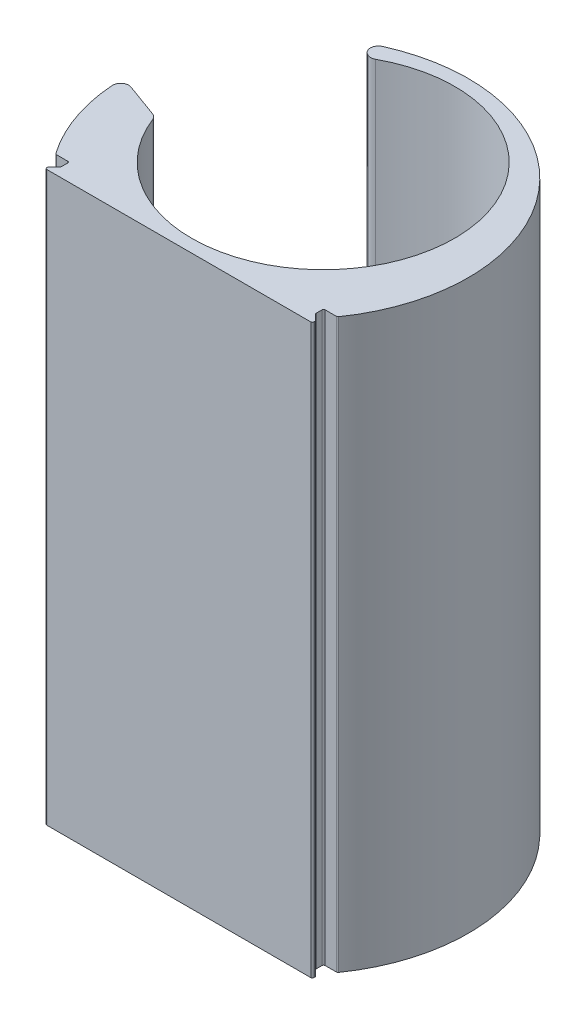
ISO-10303-21;
HEADER;
FILE_DESCRIPTION(('STEP AP214'),'2;1');
FILE_NAME('part.step','',(''),(''),'','','');
FILE_SCHEMA(('AUTOMOTIVE_DESIGN { 1 0 10303 214 1 1 1 1 }'));
ENDSEC;
DATA;
#1=APPLICATION_CONTEXT('core data for automotive mechanical design processes');
#2=APPLICATION_PROTOCOL_DEFINITION('international standard','automotive_design',2000,#1);
#3=PRODUCT_CONTEXT('',#1,'mechanical');
#4=PRODUCT('Part','Part','',(#3));
#5=PRODUCT_RELATED_PRODUCT_CATEGORY('part','',(#4));
#6=PRODUCT_DEFINITION_FORMATION('','',#4);
#7=PRODUCT_DEFINITION_CONTEXT('part definition',#1,'design');
#8=PRODUCT_DEFINITION('design','',#6,#7);
#9=PRODUCT_DEFINITION_SHAPE('','',#8);
#10=(LENGTH_UNIT() NAMED_UNIT(*) SI_UNIT(.MILLI.,.METRE.));
#11=(NAMED_UNIT(*) PLANE_ANGLE_UNIT() SI_UNIT($,.RADIAN.));
#12=(NAMED_UNIT(*) SI_UNIT($,.STERADIAN.) SOLID_ANGLE_UNIT());
#13=UNCERTAINTY_MEASURE_WITH_UNIT(LENGTH_MEASURE(1.E-05),#10,'distance_accuracy_value','');
#14=(GEOMETRIC_REPRESENTATION_CONTEXT(3) GLOBAL_UNCERTAINTY_ASSIGNED_CONTEXT((#13)) GLOBAL_UNIT_ASSIGNED_CONTEXT((#10,
#11,#12)) REPRESENTATION_CONTEXT('',''));
#15=CARTESIAN_POINT('',(0.,0.,0.));
#16=DIRECTION('',(0.,0.,1.));
#17=DIRECTION('',(1.,0.,0.));
#18=AXIS2_PLACEMENT_3D('',#15,#16,#17);
#19=CARTESIAN_POINT('',(-35.9484338432653,70.,15.2835908548455));
#20=DIRECTION('',(0.,-1.,0.));
#21=DIRECTION('',(0.,0.,-1.));
#22=AXIS2_PLACEMENT_3D('',#19,#20,#21);
#23=PLANE('',#22);
#24=DIRECTION('',(1.,0.,0.));
#25=VECTOR('',#24,1.);
#26=CARTESIAN_POINT('',(-18.3863018089094,70.,27.6860711877405));
#27=LINE('',#26,#25);
#28=CARTESIAN_POINT('',(-19.8984338432654,70.,27.6860711877405));
#29=VERTEX_POINT('',#28);
#30=CARTESIAN_POINT('',(-18.490213036857,70.,27.6860711877405));
#31=VERTEX_POINT('',#30);
#32=EDGE_CURVE('E417',#29,#31,#27,.T.);
#33=ORIENTED_EDGE('',*,*,#32,.T.);
#34=CARTESIAN_POINT('',(-18.490213036857,70.,27.4860711877405));
#35=DIRECTION('',(0.,-1.,0.));
#36=DIRECTION('',(0.,0.,-1.));
#37=AXIS2_PLACEMENT_3D('',#34,#35,#36);
#38=CIRCLE('',#37,0.2);
#39=CARTESIAN_POINT('',(-18.3262860809282,70.,27.6006484678616));
#40=VERTEX_POINT('',#39);
#41=EDGE_CURVE('E318',#31,#40,#38,.F.);
#42=ORIENTED_EDGE('',*,*,#41,.T.);
#43=CARTESIAN_POINT('',(-35.9484338432653,70.,15.2835908548455));
#44=DIRECTION('',(0.,1.,0.));
#45=DIRECTION('',(0.,0.,-1.));
#46=AXIS2_PLACEMENT_3D('',#43,#44,#45);
#47=CIRCLE('',#46,21.5);
#48=CARTESIAN_POINT('',(-44.7673259133943,70.,-4.32449784995735));
#49=VERTEX_POINT('',#48);
#50=EDGE_CURVE('E246',#40,#49,#47,.T.);
#51=ORIENTED_EDGE('',*,*,#50,.T.);
#52=CARTESIAN_POINT('',(-44.3571448868767,70.,-3.41249372415257));
#53=DIRECTION('',(0.,-1.,0.));
#54=DIRECTION('',(0.,0.,-1.));
#55=AXIS2_PLACEMENT_3D('',#52,#53,#54);
#56=CIRCLE('',#55,1.);
#57=CARTESIAN_POINT('',(-44.6991650302024,70.,-2.47280110336666));
#58=VERTEX_POINT('',#57);
#59=EDGE_CURVE('E236',#49,#58,#56,.F.);
#60=ORIENTED_EDGE('',*,*,#59,.T.);
#61=DIRECTION('',(-0.939692620785908,0.,-0.34202014332567));
#62=VECTOR('',#61,1.);
#63=CARTESIAN_POINT('',(-42.4335493384145,70.,-1.64818442926943));
#64=LINE('',#63,#62);
#65=CARTESIAN_POINT('',(-44.6276795017162,70.,-2.44678249881691));
#66=VERTEX_POINT('',#65);
#67=EDGE_CURVE('E438',#66,#58,#64,.T.);
#68=ORIENTED_EDGE('',*,*,#67,.F.);
#69=CARTESIAN_POINT('',(-44.2856593583906,70.,-3.38647511960282));
#70=DIRECTION('',(0.,-1.,0.));
#71=DIRECTION('',(0.,0.,-1.));
#72=AXIS2_PLACEMENT_3D('',#69,#70,#71);
#73=CIRCLE('',#72,1.);
#74=CARTESIAN_POINT('',(-43.8065084667167,70.,-2.50874257320378));
#75=VERTEX_POINT('',#74);
#76=EDGE_CURVE('E264',#66,#75,#73,.F.);
#77=ORIENTED_EDGE('',*,*,#76,.T.);
#78=CARTESIAN_POINT('',(-35.9484338432653,70.,11.8860711877405));
#79=DIRECTION('',(0.,1.,0.));
#80=DIRECTION('',(0.,0.,1.));
#81=AXIS2_PLACEMENT_3D('',#78,#79,#80);
#82=CIRCLE('',#81,16.4);
#83=CARTESIAN_POINT('',(-51.2208761714548,70.,17.8620652750976));
#84=VERTEX_POINT('',#83);
#85=EDGE_CURVE('E247',#84,#75,#82,.T.);
#86=ORIENTED_EDGE('',*,*,#85,.F.);
#87=CARTESIAN_POINT('',(-52.152122654881,70.,18.2264551584731));
#88=DIRECTION('',(0.,-1.,0.));
#89=DIRECTION('',(0.,0.,-1.));
#90=AXIS2_PLACEMENT_3D('',#87,#88,#89);
#91=CIRCLE('',#90,1.);
#92=CARTESIAN_POINT('',(-51.8101025115553,70.,17.2867625376872));
#93=VERTEX_POINT('',#92);
#94=EDGE_CURVE('E266',#84,#93,#91,.F.);
#95=ORIENTED_EDGE('',*,*,#94,.T.);
#96=DIRECTION('',(0.939692620785908,0.,0.342020143325669));
#97=VECTOR('',#96,1.);
#98=CARTESIAN_POINT('',(-49.6159723482535,70.,18.0853606072346));
#99=LINE('',#98,#97);
#100=CARTESIAN_POINT('',(-56.0587944961811,70.,15.7403651207179));
#101=VERTEX_POINT('',#100);
#102=EDGE_CURVE('E231',#101,#93,#99,.T.);
#103=ORIENTED_EDGE('',*,*,#102,.F.);
#104=CARTESIAN_POINT('',(-56.4008146395068,70.,16.6800577415038));
#105=DIRECTION('',(0.,-1.,0.));
#106=DIRECTION('',(0.,0.,-1.));
#107=AXIS2_PLACEMENT_3D('',#104,#105,#106);
#108=CIRCLE('',#107,1.);
#109=CARTESIAN_POINT('',(-57.3984917515186,70.,16.7481780774384));
#110=VERTEX_POINT('',#109);
#111=EDGE_CURVE('E225',#101,#110,#108,.F.);
#112=ORIENTED_EDGE('',*,*,#111,.T.);
#113=CARTESIAN_POINT('',(-53.5705816056024,70.,27.6006484678615));
#114=VERTEX_POINT('',#113);
#115=EDGE_CURVE('E228',#110,#114,#47,.T.);
#116=ORIENTED_EDGE('',*,*,#115,.T.);
#117=CARTESIAN_POINT('',(-53.4066546496737,70.,27.4860711877405));
#118=DIRECTION('',(0.,-1.,0.));
#119=DIRECTION('',(0.,0.,-1.));
#120=AXIS2_PLACEMENT_3D('',#117,#118,#119);
#121=CIRCLE('',#120,0.2);
#122=CARTESIAN_POINT('',(-53.4066546496737,70.,27.6860711877405));
#123=VERTEX_POINT('',#122);
#124=EDGE_CURVE('E308',#114,#123,#121,.F.);
#125=ORIENTED_EDGE('',*,*,#124,.T.);
#126=DIRECTION('',(1.,0.,0.));
#127=VECTOR('',#126,1.);
#128=CARTESIAN_POINT('',(-51.7984338432654,70.,27.6860711877405));
#129=LINE('',#128,#127);
#130=CARTESIAN_POINT('',(-51.9984338432654,70.,27.6860711877405));
#131=VERTEX_POINT('',#130);
#132=EDGE_CURVE('E394',#123,#131,#129,.T.);
#133=ORIENTED_EDGE('',*,*,#132,.T.);
#134=CARTESIAN_POINT('',(-51.9984338432654,70.,27.8860711877405));
#135=DIRECTION('',(0.,-1.,0.));
#136=DIRECTION('',(0.,0.,-1.));
#137=AXIS2_PLACEMENT_3D('',#134,#135,#136);
#138=CIRCLE('',#137,0.2);
#139=CARTESIAN_POINT('',(-51.7984338432654,70.,27.8860711877405));
#140=VERTEX_POINT('',#139);
#141=EDGE_CURVE('E11',#131,#140,#138,.T.);
#142=ORIENTED_EDGE('',*,*,#141,.T.);
#143=DIRECTION('',(0.,0.,1.));
#144=VECTOR('',#143,1.);
#145=CARTESIAN_POINT('',(-51.7984338432654,70.,28.6982032220964));
#146=LINE('',#145,#144);
#147=CARTESIAN_POINT('',(-51.7984338432654,70.,28.6153605096218));
#148=VERTEX_POINT('',#147);
#149=EDGE_CURVE('E392',#140,#148,#146,.T.);
#150=ORIENTED_EDGE('',*,*,#149,.T.);
#151=CARTESIAN_POINT('',(-51.9984338432654,70.,28.6153605096218));
#152=DIRECTION('',(0.,-1.,0.));
#153=DIRECTION('',(0.,0.,-1.));
#154=AXIS2_PLACEMENT_3D('',#151,#152,#153);
#155=CIRCLE('',#154,0.2);
#156=CARTESIAN_POINT('',(-51.857012487028,70.,28.7567818658591));
#157=VERTEX_POINT('',#156);
#158=EDGE_CURVE('E368',#148,#157,#155,.T.);
#159=ORIENTED_EDGE('',*,*,#158,.T.);
#160=DIRECTION('',(-0.707106781186547,0.,0.707106781186547));
#161=VECTOR('',#160,1.);
#162=CARTESIAN_POINT('',(-52.5984338432654,70.,29.4982032220964));
#163=LINE('',#162,#161);
#164=CARTESIAN_POINT('',(-52.5398551995027,70.,29.4396245783337));
#165=VERTEX_POINT('',#164);
#166=EDGE_CURVE('E398',#157,#165,#163,.T.);
#167=ORIENTED_EDGE('',*,*,#166,.T.);
#168=CARTESIAN_POINT('',(-52.3984338432654,70.,29.581045934571));
#169=DIRECTION('',(0.,-1.,0.));
#170=DIRECTION('',(0.,0.,-1.));
#171=AXIS2_PLACEMENT_3D('',#168,#169,#170);
#172=CIRCLE('',#171,0.2);
#173=CARTESIAN_POINT('',(-52.5984338432654,70.,29.581045934571));
#174=VERTEX_POINT('',#173);
#175=EDGE_CURVE('E310',#165,#174,#172,.F.);
#176=ORIENTED_EDGE('',*,*,#175,.T.);
#177=DIRECTION('',(0.,0.,1.));
#178=VECTOR('',#177,1.);
#179=CARTESIAN_POINT('',(-52.5984338432654,70.,29.8860711877405));
#180=LINE('',#179,#178);
#181=CARTESIAN_POINT('',(-52.5984338432654,70.,29.6860711877405));
#182=VERTEX_POINT('',#181);
#183=EDGE_CURVE('E401',#174,#182,#180,.T.);
#184=ORIENTED_EDGE('',*,*,#183,.T.);
#185=CARTESIAN_POINT('',(-52.3984338432654,70.,29.6860711877405));
#186=DIRECTION('',(0.,-1.,0.));
#187=DIRECTION('',(0.,0.,-1.));
#188=AXIS2_PLACEMENT_3D('',#185,#186,#187);
#189=CIRCLE('',#188,0.2);
#190=CARTESIAN_POINT('',(-52.3984338432654,70.,29.8860711877405));
#191=VERTEX_POINT('',#190);
#192=EDGE_CURVE('E312',#182,#191,#189,.F.);
#193=ORIENTED_EDGE('',*,*,#192,.T.);
#194=DIRECTION('',(1.,0.,0.));
#195=VECTOR('',#194,1.);
#196=CARTESIAN_POINT('',(-52.5984338432654,70.,29.8860711877405));
#197=LINE('',#196,#195);
#198=CARTESIAN_POINT('',(-19.4984338432653,70.,29.8860711877405));
#199=VERTEX_POINT('',#198);
#200=EDGE_CURVE('E407',#191,#199,#197,.T.);
#201=ORIENTED_EDGE('',*,*,#200,.T.);
#202=CARTESIAN_POINT('',(-19.4984338432653,70.,29.6860711877405));
#203=DIRECTION('',(0.,-1.,0.));
#204=DIRECTION('',(0.,0.,-1.));
#205=AXIS2_PLACEMENT_3D('',#202,#203,#204);
#206=CIRCLE('',#205,0.2);
#207=CARTESIAN_POINT('',(-19.2984338432653,70.,29.6860711877405));
#208=VERTEX_POINT('',#207);
#209=EDGE_CURVE('E314',#199,#208,#206,.F.);
#210=ORIENTED_EDGE('',*,*,#209,.T.);
#211=DIRECTION('',(0.,0.,-1.));
#212=VECTOR('',#211,1.);
#213=CARTESIAN_POINT('',(-19.2984338432653,70.,29.4982032220964));
#214=LINE('',#213,#212);
#215=CARTESIAN_POINT('',(-19.2984338432653,70.,29.5810459345711));
#216=VERTEX_POINT('',#215);
#217=EDGE_CURVE('E410',#208,#216,#214,.T.);
#218=ORIENTED_EDGE('',*,*,#217,.T.);
#219=CARTESIAN_POINT('',(-19.4984338432653,70.,29.5810459345711));
#220=DIRECTION('',(0.,-1.,0.));
#221=DIRECTION('',(0.,0.,-1.));
#222=AXIS2_PLACEMENT_3D('',#219,#220,#221);
#223=CIRCLE('',#222,0.2);
#224=CARTESIAN_POINT('',(-19.357012487028,70.,29.4396245783338));
#225=VERTEX_POINT('',#224);
#226=EDGE_CURVE('E316',#216,#225,#223,.F.);
#227=ORIENTED_EDGE('',*,*,#226,.T.);
#228=DIRECTION('',(-0.707106781186547,0.,-0.707106781186547));
#229=VECTOR('',#228,1.);
#230=CARTESIAN_POINT('',(-20.0984338432653,70.,28.6982032220964));
#231=LINE('',#230,#229);
#232=CARTESIAN_POINT('',(-20.0398551995027,70.,28.7567818658591));
#233=VERTEX_POINT('',#232);
#234=EDGE_CURVE('E413',#225,#233,#231,.T.);
#235=ORIENTED_EDGE('',*,*,#234,.T.);
#236=CARTESIAN_POINT('',(-19.8984338432654,70.,28.6153605096218));
#237=DIRECTION('',(0.,-1.,0.));
#238=DIRECTION('',(0.,0.,-1.));
#239=AXIS2_PLACEMENT_3D('',#236,#237,#238);
#240=CIRCLE('',#239,0.2);
#241=CARTESIAN_POINT('',(-20.0984338432653,70.,28.6153605096218));
#242=VERTEX_POINT('',#241);
#243=EDGE_CURVE('E61',#233,#242,#240,.T.);
#244=ORIENTED_EDGE('',*,*,#243,.T.);
#245=DIRECTION('',(0.,0.,-1.));
#246=VECTOR('',#245,1.);
#247=CARTESIAN_POINT('',(-20.0984338432653,70.,27.6860711877405));
#248=LINE('',#247,#246);
#249=CARTESIAN_POINT('',(-20.0984338432653,70.,27.8860711877405));
#250=VERTEX_POINT('',#249);
#251=EDGE_CURVE('E415',#242,#250,#248,.T.);
#252=ORIENTED_EDGE('',*,*,#251,.T.);
#253=CARTESIAN_POINT('',(-19.8984338432654,70.,27.8860711877405));
#254=DIRECTION('',(0.,-1.,0.));
#255=DIRECTION('',(0.,0.,-1.));
#256=AXIS2_PLACEMENT_3D('',#253,#254,#255);
#257=CIRCLE('',#256,0.2);
#258=EDGE_CURVE('E361',#250,#29,#257,.T.);
#259=ORIENTED_EDGE('',*,*,#258,.T.);
#260=EDGE_LOOP('',(#33,#42,#51,#60,#68,#77,#86,#95,#103,#112,#116,#125,#133,#142,#150,#159,#167,
#176,#184,#193,#201,#210,#218,#227,#235,#244,#252,#259));
#261=FACE_BOUND('',#260,.T.);
#262=ADVANCED_FACE('F39',(#261),#23,.F.);
#263=CARTESIAN_POINT('',(-35.9484338432653,70.,15.2835908548455));
#264=DIRECTION('',(0.,-1.,0.));
#265=DIRECTION('',(0.,0.,-1.));
#266=AXIS2_PLACEMENT_3D('',#263,#264,#265);
#267=CYLINDRICAL_SURFACE('',#266,21.5);
#268=ORIENTED_EDGE('',*,*,#50,.F.);
#269=DIRECTION('',(0.,-1.,0.));
#270=VECTOR('',#269,1.);
#271=CARTESIAN_POINT('',(-18.3262860809282,70.,27.6006484678616));
#272=LINE('',#271,#270);
#273=CARTESIAN_POINT('',(-18.3262860809282,-0.8,27.6006484678616));
#274=VERTEX_POINT('',#273);
#275=EDGE_CURVE('E288',#40,#274,#272,.T.);
#276=ORIENTED_EDGE('',*,*,#275,.T.);
#277=CARTESIAN_POINT('',(-35.9484338432653,-0.8,15.2835908548455));
#278=DIRECTION('',(0.,-1.,0.));
#279=DIRECTION('',(0.,0.,-1.));
#280=AXIS2_PLACEMENT_3D('',#277,#278,#279);
#281=CIRCLE('',#280,21.5);
#282=CARTESIAN_POINT('',(-53.5705816056024,-0.8,27.6006484678615));
#283=VERTEX_POINT('',#282);
#284=EDGE_CURVE('E450',#283,#274,#281,.T.);
#285=ORIENTED_EDGE('',*,*,#284,.F.);
#286=DIRECTION('',(0.,-1.,0.));
#287=VECTOR('',#286,1.);
#288=CARTESIAN_POINT('',(-53.5705816056024,70.,27.6006484678615));
#289=LINE('',#288,#287);
#290=EDGE_CURVE('E245',#283,#114,#289,.F.);
#291=ORIENTED_EDGE('',*,*,#290,.T.);
#292=ORIENTED_EDGE('',*,*,#115,.F.);
#293=DIRECTION('',(0.,-1.,0.));
#294=VECTOR('',#293,1.);
#295=CARTESIAN_POINT('',(-57.3984917515186,70.,16.7481780774384));
#296=LINE('',#295,#294);
#297=CARTESIAN_POINT('',(-57.3984917515186,6.00000000000001,16.7481780774384));
#298=VERTEX_POINT('',#297);
#299=EDGE_CURVE('E242',#110,#298,#296,.T.);
#300=ORIENTED_EDGE('',*,*,#299,.T.);
#301=CARTESIAN_POINT('',(-35.9484338432653,6.00000000000001,15.2835908548455));
#302=DIRECTION('',(0.,-1.,0.));
#303=DIRECTION('',(0.,0.,-1.));
#304=AXIS2_PLACEMENT_3D('',#301,#302,#303);
#305=CIRCLE('',#304,21.5);
#306=CARTESIAN_POINT('',(-44.7673259133943,6.00000000000001,-4.32449784995735));
#307=VERTEX_POINT('',#306);
#308=EDGE_CURVE('E448',#298,#307,#305,.T.);
#309=ORIENTED_EDGE('',*,*,#308,.T.);
#310=DIRECTION('',(0.,-1.,0.));
#311=VECTOR('',#310,1.);
#312=CARTESIAN_POINT('',(-44.7673259133943,70.,-4.32449784995735));
#313=LINE('',#312,#311);
#314=EDGE_CURVE('E253',#307,#49,#313,.F.);
#315=ORIENTED_EDGE('',*,*,#314,.T.);
#316=EDGE_LOOP('',(#268,#276,#285,#291,#292,#300,#309,#315));
#317=FACE_BOUND('',#316,.T.);
#318=ADVANCED_FACE('F241',(#317),#267,.T.);
#319=CARTESIAN_POINT('',(-51.7984338432654,70.,27.6860711877405));
#320=DIRECTION('',(0.,0.,-1.));
#321=DIRECTION('',(-1.,0.,0.));
#322=AXIS2_PLACEMENT_3D('',#319,#320,#321);
#323=PLANE('',#322);
#324=DIRECTION('',(-1.,0.,0.));
#325=VECTOR('',#324,1.);
#326=CARTESIAN_POINT('',(-51.7984338432654,-0.8,27.6860711877405));
#327=LINE('',#326,#325);
#328=CARTESIAN_POINT('',(-51.9984338432654,-0.8,27.6860711877405));
#329=VERTEX_POINT('',#328);
#330=CARTESIAN_POINT('',(-53.4066546496737,-0.8,27.6860711877405));
#331=VERTEX_POINT('',#330);
#332=EDGE_CURVE('E375',#329,#331,#327,.T.);
#333=ORIENTED_EDGE('',*,*,#332,.F.);
#334=DIRECTION('',(0.,-1.,0.));
#335=VECTOR('',#334,1.);
#336=CARTESIAN_POINT('',(-51.9984338432654,70.,27.6860711877405));
#337=LINE('',#336,#335);
#338=EDGE_CURVE('E357',#329,#131,#337,.F.);
#339=ORIENTED_EDGE('',*,*,#338,.T.);
#340=ORIENTED_EDGE('',*,*,#132,.F.);
#341=DIRECTION('',(0.,-1.,0.));
#342=VECTOR('',#341,1.);
#343=CARTESIAN_POINT('',(-53.4066546496737,70.,27.6860711877405));
#344=LINE('',#343,#342);
#345=EDGE_CURVE('E354',#123,#331,#344,.T.);
#346=ORIENTED_EDGE('',*,*,#345,.T.);
#347=EDGE_LOOP('',(#333,#339,#340,#346));
#348=FACE_BOUND('',#347,.T.);
#349=ADVANCED_FACE('F382',(#348),#323,.F.);
#350=CARTESIAN_POINT('',(-51.7984338432654,70.,28.6982032220964));
#351=DIRECTION('',(1.,0.,0.));
#352=DIRECTION('',(0.,0.,-1.));
#353=AXIS2_PLACEMENT_3D('',#350,#351,#352);
#354=PLANE('',#353);
#355=DIRECTION('',(0.,0.,-1.));
#356=VECTOR('',#355,1.);
#357=CARTESIAN_POINT('',(-51.7984338432654,-0.8,28.6982032220964));
#358=LINE('',#357,#356);
#359=CARTESIAN_POINT('',(-51.7984338432654,-0.8,28.6153605096218));
#360=VERTEX_POINT('',#359);
#361=CARTESIAN_POINT('',(-51.7984338432654,-0.8,27.8860711877405));
#362=VERTEX_POINT('',#361);
#363=EDGE_CURVE('E377',#360,#362,#358,.T.);
#364=ORIENTED_EDGE('',*,*,#363,.F.);
#365=DIRECTION('',(0.,-1.,0.));
#366=VECTOR('',#365,1.);
#367=CARTESIAN_POINT('',(-51.7984338432654,70.,28.6153605096218));
#368=LINE('',#367,#366);
#369=EDGE_CURVE('E352',#360,#148,#368,.F.);
#370=ORIENTED_EDGE('',*,*,#369,.T.);
#371=ORIENTED_EDGE('',*,*,#149,.F.);
#372=DIRECTION('',(0.,-1.,0.));
#373=VECTOR('',#372,1.);
#374=CARTESIAN_POINT('',(-51.7984338432654,-0.799999999999995,27.8860711877405));
#375=LINE('',#374,#373);
#376=EDGE_CURVE('E349',#140,#362,#375,.T.);
#377=ORIENTED_EDGE('',*,*,#376,.T.);
#378=EDGE_LOOP('',(#364,#370,#371,#377));
#379=FACE_BOUND('',#378,.T.);
#380=ADVANCED_FACE('F396',(#379),#354,.F.);
#381=CARTESIAN_POINT('',(-52.5984338432654,70.,29.4982032220964));
#382=DIRECTION('',(0.707106781186548,0.,0.707106781186548));
#383=DIRECTION('',(0.707106781186548,0.,-0.707106781186548));
#384=AXIS2_PLACEMENT_3D('',#381,#382,#383);
#385=PLANE('',#384);
#386=DIRECTION('',(0.707106781186547,0.,-0.707106781186547));
#387=VECTOR('',#386,1.);
#388=CARTESIAN_POINT('',(-52.5984338432654,-0.8,29.4982032220964));
#389=LINE('',#388,#387);
#390=CARTESIAN_POINT('',(-52.5398551995027,-0.8,29.4396245783337));
#391=VERTEX_POINT('',#390);
#392=CARTESIAN_POINT('',(-51.857012487028,-0.8,28.7567818658591));
#393=VERTEX_POINT('',#392);
#394=EDGE_CURVE('E470',#391,#393,#389,.T.);
#395=ORIENTED_EDGE('',*,*,#394,.F.);
#396=DIRECTION('',(0.,-1.,0.));
#397=VECTOR('',#396,1.);
#398=CARTESIAN_POINT('',(-52.5398551995027,70.,29.4396245783337));
#399=LINE('',#398,#397);
#400=EDGE_CURVE('E347',#391,#165,#399,.F.);
#401=ORIENTED_EDGE('',*,*,#400,.T.);
#402=ORIENTED_EDGE('',*,*,#166,.F.);
#403=DIRECTION('',(0.,-1.,0.));
#404=VECTOR('',#403,1.);
#405=CARTESIAN_POINT('',(-51.857012487028,-0.799999999999995,28.7567818658591));
#406=LINE('',#405,#404);
#407=EDGE_CURVE('E344',#157,#393,#406,.T.);
#408=ORIENTED_EDGE('',*,*,#407,.T.);
#409=EDGE_LOOP('',(#395,#401,#402,#408));
#410=FACE_BOUND('',#409,.T.);
#411=ADVANCED_FACE('F529',(#410),#385,.F.);
#412=CARTESIAN_POINT('',(-52.5984338432654,70.,29.8860711877405));
#413=DIRECTION('',(1.,0.,0.));
#414=DIRECTION('',(0.,0.,-1.));
#415=AXIS2_PLACEMENT_3D('',#412,#413,#414);
#416=PLANE('',#415);
#417=DIRECTION('',(0.,0.,-1.));
#418=VECTOR('',#417,1.);
#419=CARTESIAN_POINT('',(-52.5984338432654,-0.8,29.8860711877405));
#420=LINE('',#419,#418);
#421=CARTESIAN_POINT('',(-52.5984338432654,-0.8,29.6860711877405));
#422=VERTEX_POINT('',#421);
#423=CARTESIAN_POINT('',(-52.5984338432654,-0.8,29.581045934571));
#424=VERTEX_POINT('',#423);
#425=EDGE_CURVE('E467',#422,#424,#420,.T.);
#426=ORIENTED_EDGE('',*,*,#425,.F.);
#427=DIRECTION('',(0.,-1.,0.));
#428=VECTOR('',#427,1.);
#429=CARTESIAN_POINT('',(-52.5984338432654,70.,29.6860711877405));
#430=LINE('',#429,#428);
#431=EDGE_CURVE('E342',#422,#182,#430,.F.);
#432=ORIENTED_EDGE('',*,*,#431,.T.);
#433=ORIENTED_EDGE('',*,*,#183,.F.);
#434=DIRECTION('',(0.,-1.,0.));
#435=VECTOR('',#434,1.);
#436=CARTESIAN_POINT('',(-52.5984338432654,70.,29.581045934571));
#437=LINE('',#436,#435);
#438=EDGE_CURVE('E339',#174,#424,#437,.T.);
#439=ORIENTED_EDGE('',*,*,#438,.T.);
#440=EDGE_LOOP('',(#426,#432,#433,#439));
#441=FACE_BOUND('',#440,.T.);
#442=ADVANCED_FACE('F525',(#441),#416,.F.);
#443=CARTESIAN_POINT('',(-52.5984338432654,70.,29.8860711877405));
#444=DIRECTION('',(0.,0.,-1.));
#445=DIRECTION('',(-1.,0.,0.));
#446=AXIS2_PLACEMENT_3D('',#443,#444,#445);
#447=PLANE('',#446);
#448=DIRECTION('',(-1.,0.,0.));
#449=VECTOR('',#448,1.);
#450=CARTESIAN_POINT('',(-19.2984338432653,-0.8,29.8860711877405));
#451=LINE('',#450,#449);
#452=CARTESIAN_POINT('',(-19.4984338432653,-0.8,29.8860711877405));
#453=VERTEX_POINT('',#452);
#454=CARTESIAN_POINT('',(-52.3984338432654,-0.8,29.8860711877405));
#455=VERTEX_POINT('',#454);
#456=EDGE_CURVE('E464',#453,#455,#451,.T.);
#457=ORIENTED_EDGE('',*,*,#456,.F.);
#458=DIRECTION('',(0.,-1.,0.));
#459=VECTOR('',#458,1.);
#460=CARTESIAN_POINT('',(-19.4984338432653,70.,29.8860711877405));
#461=LINE('',#460,#459);
#462=EDGE_CURVE('E337',#453,#199,#461,.F.);
#463=ORIENTED_EDGE('',*,*,#462,.T.);
#464=ORIENTED_EDGE('',*,*,#200,.F.);
#465=DIRECTION('',(0.,-1.,0.));
#466=VECTOR('',#465,1.);
#467=CARTESIAN_POINT('',(-52.3984338432654,70.,29.8860711877405));
#468=LINE('',#467,#466);
#469=EDGE_CURVE('E334',#191,#455,#468,.T.);
#470=ORIENTED_EDGE('',*,*,#469,.T.);
#471=EDGE_LOOP('',(#457,#463,#464,#470));
#472=FACE_BOUND('',#471,.T.);
#473=ADVANCED_FACE('F521',(#472),#447,.F.);
#474=CARTESIAN_POINT('',(-19.2984338432653,70.,29.4982032220964));
#475=DIRECTION('',(-1.,0.,0.));
#476=DIRECTION('',(0.,0.,1.));
#477=AXIS2_PLACEMENT_3D('',#474,#475,#476);
#478=PLANE('',#477);
#479=DIRECTION('',(0.,0.,1.));
#480=VECTOR('',#479,1.);
#481=CARTESIAN_POINT('',(-19.2984338432653,-0.8,29.4982032220964));
#482=LINE('',#481,#480);
#483=CARTESIAN_POINT('',(-19.2984338432653,-0.8,29.5810459345711));
#484=VERTEX_POINT('',#483);
#485=CARTESIAN_POINT('',(-19.2984338432653,-0.8,29.6860711877405));
#486=VERTEX_POINT('',#485);
#487=EDGE_CURVE('E461',#484,#486,#482,.T.);
#488=ORIENTED_EDGE('',*,*,#487,.F.);
#489=DIRECTION('',(0.,-1.,0.));
#490=VECTOR('',#489,1.);
#491=CARTESIAN_POINT('',(-19.2984338432653,70.,29.5810459345711));
#492=LINE('',#491,#490);
#493=EDGE_CURVE('E332',#484,#216,#492,.F.);
#494=ORIENTED_EDGE('',*,*,#493,.T.);
#495=ORIENTED_EDGE('',*,*,#217,.F.);
#496=DIRECTION('',(0.,-1.,0.));
#497=VECTOR('',#496,1.);
#498=CARTESIAN_POINT('',(-19.2984338432653,70.,29.6860711877405));
#499=LINE('',#498,#497);
#500=EDGE_CURVE('E329',#208,#486,#499,.T.);
#501=ORIENTED_EDGE('',*,*,#500,.T.);
#502=EDGE_LOOP('',(#488,#494,#495,#501));
#503=FACE_BOUND('',#502,.T.);
#504=ADVANCED_FACE('F517',(#503),#478,.F.);
#505=CARTESIAN_POINT('',(-20.0984338432653,70.,28.6982032220964));
#506=DIRECTION('',(-0.707106781186548,0.,0.707106781186548));
#507=DIRECTION('',(0.707106781186548,0.,0.707106781186548));
#508=AXIS2_PLACEMENT_3D('',#505,#506,#507);
#509=PLANE('',#508);
#510=DIRECTION('',(0.707106781186547,0.,0.707106781186547));
#511=VECTOR('',#510,1.);
#512=CARTESIAN_POINT('',(-20.0984338432653,-0.8,28.6982032220964));
#513=LINE('',#512,#511);
#514=CARTESIAN_POINT('',(-20.0398551995027,-0.8,28.7567818658591));
#515=VERTEX_POINT('',#514);
#516=CARTESIAN_POINT('',(-19.357012487028,-0.8,29.4396245783338));
#517=VERTEX_POINT('',#516);
#518=EDGE_CURVE('E458',#515,#517,#513,.T.);
#519=ORIENTED_EDGE('',*,*,#518,.F.);
#520=DIRECTION('',(0.,-1.,0.));
#521=VECTOR('',#520,1.);
#522=CARTESIAN_POINT('',(-20.0398551995027,70.,28.7567818658591));
#523=LINE('',#522,#521);
#524=EDGE_CURVE('E327',#515,#233,#523,.F.);
#525=ORIENTED_EDGE('',*,*,#524,.T.);
#526=ORIENTED_EDGE('',*,*,#234,.F.);
#527=DIRECTION('',(0.,-1.,0.));
#528=VECTOR('',#527,1.);
#529=CARTESIAN_POINT('',(-19.357012487028,70.,29.4396245783338));
#530=LINE('',#529,#528);
#531=EDGE_CURVE('E324',#225,#517,#530,.T.);
#532=ORIENTED_EDGE('',*,*,#531,.T.);
#533=EDGE_LOOP('',(#519,#525,#526,#532));
#534=FACE_BOUND('',#533,.T.);
#535=ADVANCED_FACE('F514',(#534),#509,.F.);
#536=CARTESIAN_POINT('',(-20.0984338432653,70.,27.6860711877405));
#537=DIRECTION('',(-1.,0.,0.));
#538=DIRECTION('',(0.,0.,1.));
#539=AXIS2_PLACEMENT_3D('',#536,#537,#538);
#540=PLANE('',#539);
#541=DIRECTION('',(0.,0.,1.));
#542=VECTOR('',#541,1.);
#543=CARTESIAN_POINT('',(-20.0984338432653,-0.8,27.6860711877405));
#544=LINE('',#543,#542);
#545=CARTESIAN_POINT('',(-20.0984338432653,-0.8,27.8860711877405));
#546=VERTEX_POINT('',#545);
#547=CARTESIAN_POINT('',(-20.0984338432653,-0.8,28.6153605096218));
#548=VERTEX_POINT('',#547);
#549=EDGE_CURVE('E455',#546,#548,#544,.T.);
#550=ORIENTED_EDGE('',*,*,#549,.F.);
#551=DIRECTION('',(0.,-1.,0.));
#552=VECTOR('',#551,1.);
#553=CARTESIAN_POINT('',(-20.0984338432653,70.,27.8860711877405));
#554=LINE('',#553,#552);
#555=EDGE_CURVE('E54',#546,#250,#554,.F.);
#556=ORIENTED_EDGE('',*,*,#555,.T.);
#557=ORIENTED_EDGE('',*,*,#251,.F.);
#558=DIRECTION('',(0.,-1.,0.));
#559=VECTOR('',#558,1.);
#560=CARTESIAN_POINT('',(-20.0984338432653,-0.799999999999995,28.6153605096218));
#561=LINE('',#560,#559);
#562=EDGE_CURVE('E320',#242,#548,#561,.T.);
#563=ORIENTED_EDGE('',*,*,#562,.T.);
#564=EDGE_LOOP('',(#550,#556,#557,#563));
#565=FACE_BOUND('',#564,.T.);
#566=ADVANCED_FACE('F510',(#565),#540,.F.);
#567=CARTESIAN_POINT('',(-18.3863018089094,70.,27.6860711877405));
#568=DIRECTION('',(0.,0.,-1.));
#569=DIRECTION('',(-1.,0.,0.));
#570=AXIS2_PLACEMENT_3D('',#567,#568,#569);
#571=PLANE('',#570);
#572=DIRECTION('',(-1.,0.,0.));
#573=VECTOR('',#572,1.);
#574=CARTESIAN_POINT('',(-18.3863018089094,-0.8,27.6860711877405));
#575=LINE('',#574,#573);
#576=CARTESIAN_POINT('',(-18.490213036857,-0.8,27.6860711877405));
#577=VERTEX_POINT('',#576);
#578=CARTESIAN_POINT('',(-19.8984338432654,-0.8,27.6860711877405));
#579=VERTEX_POINT('',#578);
#580=EDGE_CURVE('E452',#577,#579,#575,.T.);
#581=ORIENTED_EDGE('',*,*,#580,.F.);
#582=DIRECTION('',(0.,-1.,0.));
#583=VECTOR('',#582,1.);
#584=CARTESIAN_POINT('',(-18.490213036857,70.,27.6860711877405));
#585=LINE('',#584,#583);
#586=EDGE_CURVE('E306',#577,#31,#585,.F.);
#587=ORIENTED_EDGE('',*,*,#586,.T.);
#588=ORIENTED_EDGE('',*,*,#32,.F.);
#589=DIRECTION('',(0.,-1.,0.));
#590=VECTOR('',#589,1.);
#591=CARTESIAN_POINT('',(-19.8984338432654,-0.799999999999995,27.6860711877405));
#592=LINE('',#591,#590);
#593=EDGE_CURVE('E303',#29,#579,#592,.T.);
#594=ORIENTED_EDGE('',*,*,#593,.T.);
#595=EDGE_LOOP('',(#581,#587,#588,#594));
#596=FACE_BOUND('',#595,.T.);
#597=ADVANCED_FACE('F507',(#596),#571,.F.);
#598=CARTESIAN_POINT('',(-35.9484338432653,70.,11.8860711877405));
#599=DIRECTION('',(0.,-1.,0.));
#600=DIRECTION('',(0.,0.,-1.));
#601=AXIS2_PLACEMENT_3D('',#598,#599,#600);
#602=CYLINDRICAL_SURFACE('',#601,16.4);
#603=CARTESIAN_POINT('',(-35.9484338432653,6.00000000000001,11.8860711877405));
#604=DIRECTION('',(0.,-1.,0.));
#605=DIRECTION('',(0.,0.,-1.));
#606=AXIS2_PLACEMENT_3D('',#603,#604,#605);
#607=CIRCLE('',#606,16.4);
#608=CARTESIAN_POINT('',(-51.2208761714548,6.00000000000001,17.8620652750976));
#609=VERTEX_POINT('',#608);
#610=CARTESIAN_POINT('',(-43.8065084667167,6.00000000000001,-2.50874257320378));
#611=VERTEX_POINT('',#610);
#612=EDGE_CURVE('E259',#609,#611,#607,.T.);
#613=ORIENTED_EDGE('',*,*,#612,.F.);
#614=DIRECTION('',(0.,-1.,0.));
#615=VECTOR('',#614,1.);
#616=CARTESIAN_POINT('',(-51.2208761714548,70.,17.8620652750976));
#617=LINE('',#616,#615);
#618=EDGE_CURVE('E276',#609,#84,#617,.F.);
#619=ORIENTED_EDGE('',*,*,#618,.T.);
#620=ORIENTED_EDGE('',*,*,#85,.T.);
#621=DIRECTION('',(0.,-1.,0.));
#622=VECTOR('',#621,1.);
#623=CARTESIAN_POINT('',(-43.8065084667167,70.,-2.50874257320378));
#624=LINE('',#623,#622);
#625=EDGE_CURVE('E273',#75,#611,#624,.T.);
#626=ORIENTED_EDGE('',*,*,#625,.T.);
#627=EDGE_LOOP('',(#613,#619,#620,#626));
#628=FACE_BOUND('',#627,.T.);
#629=CARTESIAN_POINT('',(-35.9484338432653,0.,11.8860711877405));
#630=DIRECTION('',(0.,1.,0.));
#631=DIRECTION('',(0.,0.,1.));
#632=AXIS2_PLACEMENT_3D('',#629,#630,#631);
#633=CIRCLE('',#632,16.4);
#634=CARTESIAN_POINT('',(-35.9484338432653,0.,28.2860711877405));
#635=VERTEX_POINT('',#634);
#636=EDGE_CURVE('E386',#635,#635,#633,.T.);
#637=ORIENTED_EDGE('',*,*,#636,.F.);
#638=EDGE_LOOP('',(#637));
#639=FACE_BOUND('',#638,.T.);
#640=ADVANCED_FACE('F428',(#628,#639),#602,.F.);
#641=CARTESIAN_POINT('',(-35.9484338432653,0.,15.2835908548455));
#642=DIRECTION('',(0.,-1.,0.));
#643=DIRECTION('',(0.,0.,-1.));
#644=AXIS2_PLACEMENT_3D('',#641,#642,#643);
#645=PLANE('',#644);
#646=ORIENTED_EDGE('',*,*,#636,.T.);
#647=EDGE_LOOP('',(#646));
#648=FACE_BOUND('',#647,.T.);
#649=ADVANCED_FACE('F551',(#648),#645,.F.);
#650=CARTESIAN_POINT('',(-35.9484338432653,-0.8,15.2835908548455));
#651=DIRECTION('',(0.,-1.,0.));
#652=DIRECTION('',(0.,0.,-1.));
#653=AXIS2_PLACEMENT_3D('',#650,#651,#652);
#654=PLANE('',#653);
#655=ORIENTED_EDGE('',*,*,#284,.T.);
#656=CARTESIAN_POINT('',(-18.490213036857,-0.799999999999995,27.4860711877405));
#657=DIRECTION('',(0.,-1.,0.));
#658=DIRECTION('',(0.,0.,-1.));
#659=AXIS2_PLACEMENT_3D('',#656,#657,#658);
#660=CIRCLE('',#659,0.2);
#661=EDGE_CURVE('E301',#274,#577,#660,.T.);
#662=ORIENTED_EDGE('',*,*,#661,.T.);
#663=ORIENTED_EDGE('',*,*,#580,.T.);
#664=CARTESIAN_POINT('',(-19.8984338432654,-0.799999999999995,27.8860711877405));
#665=DIRECTION('',(0.,-1.,0.));
#666=DIRECTION('',(0.,0.,-1.));
#667=AXIS2_PLACEMENT_3D('',#664,#665,#666);
#668=CIRCLE('',#667,0.2);
#669=EDGE_CURVE('E359',#579,#546,#668,.F.);
#670=ORIENTED_EDGE('',*,*,#669,.T.);
#671=ORIENTED_EDGE('',*,*,#549,.T.);
#672=CARTESIAN_POINT('',(-19.8984338432654,-0.799999999999995,28.6153605096218));
#673=DIRECTION('',(0.,-1.,0.));
#674=DIRECTION('',(0.,0.,-1.));
#675=AXIS2_PLACEMENT_3D('',#672,#673,#674);
#676=CIRCLE('',#675,0.2);
#677=EDGE_CURVE('E363',#548,#515,#676,.F.);
#678=ORIENTED_EDGE('',*,*,#677,.T.);
#679=ORIENTED_EDGE('',*,*,#518,.T.);
#680=CARTESIAN_POINT('',(-19.4984338432653,-0.799999999999995,29.5810459345711));
#681=DIRECTION('',(0.,-1.,0.));
#682=DIRECTION('',(0.,0.,-1.));
#683=AXIS2_PLACEMENT_3D('',#680,#681,#682);
#684=CIRCLE('',#683,0.2);
#685=EDGE_CURVE('E299',#517,#484,#684,.T.);
#686=ORIENTED_EDGE('',*,*,#685,.T.);
#687=ORIENTED_EDGE('',*,*,#487,.T.);
#688=CARTESIAN_POINT('',(-19.4984338432653,-0.799999999999995,29.6860711877405));
#689=DIRECTION('',(0.,-1.,0.));
#690=DIRECTION('',(0.,0.,-1.));
#691=AXIS2_PLACEMENT_3D('',#688,#689,#690);
#692=CIRCLE('',#691,0.2);
#693=EDGE_CURVE('E297',#486,#453,#692,.T.);
#694=ORIENTED_EDGE('',*,*,#693,.T.);
#695=ORIENTED_EDGE('',*,*,#456,.T.);
#696=CARTESIAN_POINT('',(-52.3984338432654,-0.799999999999995,29.6860711877405));
#697=DIRECTION('',(0.,-1.,0.));
#698=DIRECTION('',(0.,0.,-1.));
#699=AXIS2_PLACEMENT_3D('',#696,#697,#698);
#700=CIRCLE('',#699,0.2);
#701=EDGE_CURVE('E295',#455,#422,#700,.T.);
#702=ORIENTED_EDGE('',*,*,#701,.T.);
#703=ORIENTED_EDGE('',*,*,#425,.T.);
#704=CARTESIAN_POINT('',(-52.3984338432654,-0.799999999999995,29.581045934571));
#705=DIRECTION('',(0.,-1.,0.));
#706=DIRECTION('',(0.,0.,-1.));
#707=AXIS2_PLACEMENT_3D('',#704,#705,#706);
#708=CIRCLE('',#707,0.2);
#709=EDGE_CURVE('E293',#424,#391,#708,.T.);
#710=ORIENTED_EDGE('',*,*,#709,.T.);
#711=ORIENTED_EDGE('',*,*,#394,.T.);
#712=CARTESIAN_POINT('',(-51.9984338432654,-0.799999999999995,28.6153605096218));
#713=DIRECTION('',(0.,-1.,0.));
#714=DIRECTION('',(0.,0.,-1.));
#715=AXIS2_PLACEMENT_3D('',#712,#713,#714);
#716=CIRCLE('',#715,0.2);
#717=EDGE_CURVE('E366',#393,#360,#716,.F.);
#718=ORIENTED_EDGE('',*,*,#717,.T.);
#719=ORIENTED_EDGE('',*,*,#363,.T.);
#720=CARTESIAN_POINT('',(-51.9984338432654,-0.799999999999995,27.8860711877405));
#721=DIRECTION('',(0.,-1.,0.));
#722=DIRECTION('',(0.,0.,-1.));
#723=AXIS2_PLACEMENT_3D('',#720,#721,#722);
#724=CIRCLE('',#723,0.2);
#725=EDGE_CURVE('E47',#362,#329,#724,.F.);
#726=ORIENTED_EDGE('',*,*,#725,.T.);
#727=ORIENTED_EDGE('',*,*,#332,.T.);
#728=CARTESIAN_POINT('',(-53.4066546496737,-0.799999999999995,27.4860711877405));
#729=DIRECTION('',(0.,-1.,0.));
#730=DIRECTION('',(0.,0.,-1.));
#731=AXIS2_PLACEMENT_3D('',#728,#729,#730);
#732=CIRCLE('',#731,0.2);
#733=EDGE_CURVE('E291',#331,#283,#732,.T.);
#734=ORIENTED_EDGE('',*,*,#733,.T.);
#735=EDGE_LOOP('',(#655,#662,#663,#670,#671,#678,#679,#686,#687,#694,#695,#702,#703,#710,#711,
#718,#719,#726,#727,#734));
#736=FACE_BOUND('',#735,.T.);
#737=ADVANCED_FACE('F374',(#736),#654,.T.);
#738=CARTESIAN_POINT('',(-49.6159723482535,6.00000000000001,18.0853606072346));
#739=DIRECTION('',(-0.342020143325669,0.,0.939692620785908));
#740=DIRECTION('',(0.939692620785908,0.,0.342020143325669));
#741=AXIS2_PLACEMENT_3D('',#738,#739,#740);
#742=PLANE('',#741);
#743=DIRECTION('',(0.939692620785908,0.,0.342020143325669));
#744=VECTOR('',#743,1.);
#745=CARTESIAN_POINT('',(-49.6159723482535,6.00000000000001,18.0853606072346));
#746=LINE('',#745,#744);
#747=CARTESIAN_POINT('',(-56.0587944961811,6.00000000000001,15.7403651207179));
#748=VERTEX_POINT('',#747);
#749=CARTESIAN_POINT('',(-51.8101025115553,6.00000000000001,17.2867625376872));
#750=VERTEX_POINT('',#749);
#751=EDGE_CURVE('E442',#748,#750,#746,.T.);
#752=ORIENTED_EDGE('',*,*,#751,.F.);
#753=DIRECTION('',(0.,-1.,0.));
#754=VECTOR('',#753,1.);
#755=CARTESIAN_POINT('',(-56.0587944961811,6.00000000000001,15.7403651207179));
#756=LINE('',#755,#754);
#757=EDGE_CURVE('E256',#748,#101,#756,.F.);
#758=ORIENTED_EDGE('',*,*,#757,.T.);
#759=ORIENTED_EDGE('',*,*,#102,.T.);
#760=DIRECTION('',(0.,1.,0.));
#761=VECTOR('',#760,1.);
#762=CARTESIAN_POINT('',(-51.8101025115553,6.00000000000001,17.2867625376872));
#763=LINE('',#762,#761);
#764=EDGE_CURVE('E252',#93,#750,#763,.F.);
#765=ORIENTED_EDGE('',*,*,#764,.T.);
#766=EDGE_LOOP('',(#752,#758,#759,#765));
#767=FACE_BOUND('',#766,.T.);
#768=ADVANCED_FACE('F484',(#767),#742,.F.);
#769=CARTESIAN_POINT('',(-42.4335493384145,6.00000000000001,-1.64818442926943));
#770=DIRECTION('',(0.34202014332567,0.,-0.939692620785908));
#771=DIRECTION('',(-0.939692620785908,0.,-0.34202014332567));
#772=AXIS2_PLACEMENT_3D('',#769,#770,#771);
#773=PLANE('',#772);
#774=ORIENTED_EDGE('',*,*,#67,.T.);
#775=DIRECTION('',(0.,-1.,0.));
#776=VECTOR('',#775,1.);
#777=CARTESIAN_POINT('',(-44.6991650302024,6.00000000000001,-2.47280110336666));
#778=LINE('',#777,#776);
#779=CARTESIAN_POINT('',(-44.6991650302024,6.00000000000001,-2.47280110336666));
#780=VERTEX_POINT('',#779);
#781=EDGE_CURVE('E271',#58,#780,#778,.T.);
#782=ORIENTED_EDGE('',*,*,#781,.T.);
#783=DIRECTION('',(-0.939692620785908,0.,-0.34202014332567));
#784=VECTOR('',#783,1.);
#785=CARTESIAN_POINT('',(-42.4335493384145,6.00000000000001,-1.64818442926943));
#786=LINE('',#785,#784);
#787=CARTESIAN_POINT('',(-44.6276795017162,6.00000000000001,-2.44678249881691));
#788=VERTEX_POINT('',#787);
#789=EDGE_CURVE('E440',#788,#780,#786,.T.);
#790=ORIENTED_EDGE('',*,*,#789,.F.);
#791=DIRECTION('',(0.,1.,0.));
#792=VECTOR('',#791,1.);
#793=CARTESIAN_POINT('',(-44.6276795017162,70.,-2.44678249881691));
#794=LINE('',#793,#792);
#795=EDGE_CURVE('E235',#788,#66,#794,.T.);
#796=ORIENTED_EDGE('',*,*,#795,.T.);
#797=EDGE_LOOP('',(#774,#782,#790,#796));
#798=FACE_BOUND('',#797,.T.);
#799=ADVANCED_FACE('F437',(#798),#773,.F.);
#800=CARTESIAN_POINT('',(0.,6.00000000000001,0.));
#801=DIRECTION('',(0.,-1.,0.));
#802=DIRECTION('',(0.,0.,-1.));
#803=AXIS2_PLACEMENT_3D('',#800,#801,#802);
#804=PLANE('',#803);
#805=ORIENTED_EDGE('',*,*,#308,.F.);
#806=CARTESIAN_POINT('',(-56.4008146395068,6.00000000000001,16.6800577415038));
#807=DIRECTION('',(0.,-1.,0.));
#808=DIRECTION('',(0.,0.,-1.));
#809=AXIS2_PLACEMENT_3D('',#806,#807,#808);
#810=CIRCLE('',#809,1.);
#811=EDGE_CURVE('E251',#298,#748,#810,.T.);
#812=ORIENTED_EDGE('',*,*,#811,.T.);
#813=ORIENTED_EDGE('',*,*,#751,.T.);
#814=CARTESIAN_POINT('',(-52.152122654881,6.00000000000001,18.2264551584731));
#815=DIRECTION('',(0.,-1.,0.));
#816=DIRECTION('',(0.,0.,-1.));
#817=AXIS2_PLACEMENT_3D('',#814,#815,#816);
#818=CIRCLE('',#817,1.);
#819=EDGE_CURVE('E282',#750,#609,#818,.T.);
#820=ORIENTED_EDGE('',*,*,#819,.T.);
#821=ORIENTED_EDGE('',*,*,#612,.T.);
#822=CARTESIAN_POINT('',(-44.2856593583906,6.00000000000001,-3.38647511960282));
#823=DIRECTION('',(0.,-1.,0.));
#824=DIRECTION('',(0.,0.,-1.));
#825=AXIS2_PLACEMENT_3D('',#822,#823,#824);
#826=CIRCLE('',#825,1.);
#827=EDGE_CURVE('E285',#611,#788,#826,.T.);
#828=ORIENTED_EDGE('',*,*,#827,.T.);
#829=ORIENTED_EDGE('',*,*,#789,.T.);
#830=CARTESIAN_POINT('',(-44.3571448868767,6.00000000000001,-3.41249372415257));
#831=DIRECTION('',(0.,-1.,0.));
#832=DIRECTION('',(0.,0.,-1.));
#833=AXIS2_PLACEMENT_3D('',#830,#831,#832);
#834=CIRCLE('',#833,1.);
#835=EDGE_CURVE('E279',#780,#307,#834,.T.);
#836=ORIENTED_EDGE('',*,*,#835,.T.);
#837=EDGE_LOOP('',(#805,#812,#813,#820,#821,#828,#829,#836));
#838=FACE_BOUND('',#837,.T.);
#839=ADVANCED_FACE('F419',(#838),#804,.F.);
#840=CARTESIAN_POINT('',(-56.4008146395068,70.,16.6800577415038));
#841=DIRECTION('',(0.,-1.,0.));
#842=DIRECTION('',(0.,0.,-1.));
#843=AXIS2_PLACEMENT_3D('',#840,#841,#842);
#844=CYLINDRICAL_SURFACE('',#843,1.);
#845=ORIENTED_EDGE('',*,*,#111,.F.);
#846=ORIENTED_EDGE('',*,*,#757,.F.);
#847=ORIENTED_EDGE('',*,*,#811,.F.);
#848=ORIENTED_EDGE('',*,*,#299,.F.);
#849=EDGE_LOOP('',(#845,#846,#847,#848));
#850=FACE_BOUND('',#849,.T.);
#851=ADVANCED_FACE('F250',(#850),#844,.T.);
#852=CARTESIAN_POINT('',(-44.3571448868767,70.,-3.41249372415257));
#853=DIRECTION('',(0.,-1.,0.));
#854=DIRECTION('',(0.,0.,-1.));
#855=AXIS2_PLACEMENT_3D('',#852,#853,#854);
#856=CYLINDRICAL_SURFACE('',#855,1.);
#857=ORIENTED_EDGE('',*,*,#835,.F.);
#858=ORIENTED_EDGE('',*,*,#781,.F.);
#859=ORIENTED_EDGE('',*,*,#59,.F.);
#860=ORIENTED_EDGE('',*,*,#314,.F.);
#861=EDGE_LOOP('',(#857,#858,#859,#860));
#862=FACE_BOUND('',#861,.T.);
#863=ADVANCED_FACE('F481',(#862),#856,.T.);
#864=CARTESIAN_POINT('',(-52.152122654881,70.,18.2264551584731));
#865=DIRECTION('',(0.,-1.,0.));
#866=DIRECTION('',(0.,0.,-1.));
#867=AXIS2_PLACEMENT_3D('',#864,#865,#866);
#868=CYLINDRICAL_SURFACE('',#867,1.);
#869=ORIENTED_EDGE('',*,*,#94,.F.);
#870=ORIENTED_EDGE('',*,*,#618,.F.);
#871=ORIENTED_EDGE('',*,*,#819,.F.);
#872=ORIENTED_EDGE('',*,*,#764,.F.);
#873=EDGE_LOOP('',(#869,#870,#871,#872));
#874=FACE_BOUND('',#873,.T.);
#875=ADVANCED_FACE('F488',(#874),#868,.T.);
#876=CARTESIAN_POINT('',(-44.2856593583906,70.,-3.38647511960282));
#877=DIRECTION('',(0.,-1.,0.));
#878=DIRECTION('',(0.,0.,-1.));
#879=AXIS2_PLACEMENT_3D('',#876,#877,#878);
#880=CYLINDRICAL_SURFACE('',#879,1.);
#881=ORIENTED_EDGE('',*,*,#827,.F.);
#882=ORIENTED_EDGE('',*,*,#625,.F.);
#883=ORIENTED_EDGE('',*,*,#76,.F.);
#884=ORIENTED_EDGE('',*,*,#795,.F.);
#885=EDGE_LOOP('',(#881,#882,#883,#884));
#886=FACE_BOUND('',#885,.T.);
#887=ADVANCED_FACE('F433',(#886),#880,.T.);
#888=CARTESIAN_POINT('',(-18.490213036857,70.,27.4860711877405));
#889=DIRECTION('',(0.,-1.,0.));
#890=DIRECTION('',(0.,0.,-1.));
#891=AXIS2_PLACEMENT_3D('',#888,#889,#890);
#892=CYLINDRICAL_SURFACE('',#891,0.2);
#893=ORIENTED_EDGE('',*,*,#41,.F.);
#894=ORIENTED_EDGE('',*,*,#586,.F.);
#895=ORIENTED_EDGE('',*,*,#661,.F.);
#896=ORIENTED_EDGE('',*,*,#275,.F.);
#897=EDGE_LOOP('',(#893,#894,#895,#896));
#898=FACE_BOUND('',#897,.T.);
#899=ADVANCED_FACE('F495',(#898),#892,.T.);
#900=CARTESIAN_POINT('',(-19.8984338432654,70.,27.8860711877405));
#901=DIRECTION('',(0.,1.,0.));
#902=DIRECTION('',(0.,0.,1.));
#903=AXIS2_PLACEMENT_3D('',#900,#901,#902);
#904=CYLINDRICAL_SURFACE('',#903,0.2);
#905=ORIENTED_EDGE('',*,*,#258,.F.);
#906=ORIENTED_EDGE('',*,*,#555,.F.);
#907=ORIENTED_EDGE('',*,*,#669,.F.);
#908=ORIENTED_EDGE('',*,*,#593,.F.);
#909=EDGE_LOOP('',(#905,#906,#907,#908));
#910=FACE_BOUND('',#909,.T.);
#911=ADVANCED_FACE('F607',(#910),#904,.F.);
#912=CARTESIAN_POINT('',(-19.8984338432654,70.,28.6153605096218));
#913=DIRECTION('',(0.,1.,0.));
#914=DIRECTION('',(0.,0.,1.));
#915=AXIS2_PLACEMENT_3D('',#912,#913,#914);
#916=CYLINDRICAL_SURFACE('',#915,0.2);
#917=ORIENTED_EDGE('',*,*,#243,.F.);
#918=ORIENTED_EDGE('',*,*,#524,.F.);
#919=ORIENTED_EDGE('',*,*,#677,.F.);
#920=ORIENTED_EDGE('',*,*,#562,.F.);
#921=EDGE_LOOP('',(#917,#918,#919,#920));
#922=FACE_BOUND('',#921,.T.);
#923=ADVANCED_FACE('F617',(#922),#916,.F.);
#924=CARTESIAN_POINT('',(-19.4984338432653,70.,29.5810459345711));
#925=DIRECTION('',(0.,-1.,0.));
#926=DIRECTION('',(0.,0.,-1.));
#927=AXIS2_PLACEMENT_3D('',#924,#925,#926);
#928=CYLINDRICAL_SURFACE('',#927,0.2);
#929=ORIENTED_EDGE('',*,*,#226,.F.);
#930=ORIENTED_EDGE('',*,*,#493,.F.);
#931=ORIENTED_EDGE('',*,*,#685,.F.);
#932=ORIENTED_EDGE('',*,*,#531,.F.);
#933=EDGE_LOOP('',(#929,#930,#931,#932));
#934=FACE_BOUND('',#933,.T.);
#935=ADVANCED_FACE('F627',(#934),#928,.T.);
#936=CARTESIAN_POINT('',(-19.4984338432653,70.,29.6860711877405));
#937=DIRECTION('',(0.,-1.,0.));
#938=DIRECTION('',(0.,0.,-1.));
#939=AXIS2_PLACEMENT_3D('',#936,#937,#938);
#940=CYLINDRICAL_SURFACE('',#939,0.2);
#941=ORIENTED_EDGE('',*,*,#209,.F.);
#942=ORIENTED_EDGE('',*,*,#462,.F.);
#943=ORIENTED_EDGE('',*,*,#693,.F.);
#944=ORIENTED_EDGE('',*,*,#500,.F.);
#945=EDGE_LOOP('',(#941,#942,#943,#944));
#946=FACE_BOUND('',#945,.T.);
#947=ADVANCED_FACE('F637',(#946),#940,.T.);
#948=CARTESIAN_POINT('',(-52.3984338432654,70.,29.6860711877405));
#949=DIRECTION('',(0.,-1.,0.));
#950=DIRECTION('',(0.,0.,-1.));
#951=AXIS2_PLACEMENT_3D('',#948,#949,#950);
#952=CYLINDRICAL_SURFACE('',#951,0.2);
#953=ORIENTED_EDGE('',*,*,#192,.F.);
#954=ORIENTED_EDGE('',*,*,#431,.F.);
#955=ORIENTED_EDGE('',*,*,#701,.F.);
#956=ORIENTED_EDGE('',*,*,#469,.F.);
#957=EDGE_LOOP('',(#953,#954,#955,#956));
#958=FACE_BOUND('',#957,.T.);
#959=ADVANCED_FACE('F647',(#958),#952,.T.);
#960=CARTESIAN_POINT('',(-52.3984338432654,70.,29.581045934571));
#961=DIRECTION('',(0.,-1.,0.));
#962=DIRECTION('',(0.,0.,-1.));
#963=AXIS2_PLACEMENT_3D('',#960,#961,#962);
#964=CYLINDRICAL_SURFACE('',#963,0.2);
#965=ORIENTED_EDGE('',*,*,#175,.F.);
#966=ORIENTED_EDGE('',*,*,#400,.F.);
#967=ORIENTED_EDGE('',*,*,#709,.F.);
#968=ORIENTED_EDGE('',*,*,#438,.F.);
#969=EDGE_LOOP('',(#965,#966,#967,#968));
#970=FACE_BOUND('',#969,.T.);
#971=ADVANCED_FACE('F657',(#970),#964,.T.);
#972=CARTESIAN_POINT('',(-51.9984338432654,70.,28.6153605096218));
#973=DIRECTION('',(0.,1.,0.));
#974=DIRECTION('',(0.,0.,1.));
#975=AXIS2_PLACEMENT_3D('',#972,#973,#974);
#976=CYLINDRICAL_SURFACE('',#975,0.2);
#977=ORIENTED_EDGE('',*,*,#158,.F.);
#978=ORIENTED_EDGE('',*,*,#369,.F.);
#979=ORIENTED_EDGE('',*,*,#717,.F.);
#980=ORIENTED_EDGE('',*,*,#407,.F.);
#981=EDGE_LOOP('',(#977,#978,#979,#980));
#982=FACE_BOUND('',#981,.T.);
#983=ADVANCED_FACE('F667',(#982),#976,.F.);
#984=CARTESIAN_POINT('',(-51.9984338432654,70.,27.8860711877405));
#985=DIRECTION('',(0.,1.,0.));
#986=DIRECTION('',(0.,0.,1.));
#987=AXIS2_PLACEMENT_3D('',#984,#985,#986);
#988=CYLINDRICAL_SURFACE('',#987,0.2);
#989=ORIENTED_EDGE('',*,*,#141,.F.);
#990=ORIENTED_EDGE('',*,*,#338,.F.);
#991=ORIENTED_EDGE('',*,*,#725,.F.);
#992=ORIENTED_EDGE('',*,*,#376,.F.);
#993=EDGE_LOOP('',(#989,#990,#991,#992));
#994=FACE_BOUND('',#993,.T.);
#995=ADVANCED_FACE('F389',(#994),#988,.F.);
#996=CARTESIAN_POINT('',(-53.4066546496737,70.,27.4860711877405));
#997=DIRECTION('',(0.,-1.,0.));
#998=DIRECTION('',(0.,0.,-1.));
#999=AXIS2_PLACEMENT_3D('',#996,#997,#998);
#1000=CYLINDRICAL_SURFACE('',#999,0.2);
#1001=ORIENTED_EDGE('',*,*,#124,.F.);
#1002=ORIENTED_EDGE('',*,*,#290,.F.);
#1003=ORIENTED_EDGE('',*,*,#733,.F.);
#1004=ORIENTED_EDGE('',*,*,#345,.F.);
#1005=EDGE_LOOP('',(#1001,#1002,#1003,#1004));
#1006=FACE_BOUND('',#1005,.T.);
#1007=ADVANCED_FACE('F41',(#1006),#1000,.T.);
#1008=CLOSED_SHELL('',(#262,#318,#349,#380,#411,#442,#473,#504,#535,#566,#597,#640,#649,#737,
#768,#799,#839,#851,#863,#875,#887,#899,#911,#923,#935,#947,#959,#971,#983,#995,#1007));
#1009=MANIFOLD_SOLID_BREP('B2',#1008);
#1010=ADVANCED_BREP_SHAPE_REPRESENTATION('',(#18,#1009),#14);
#1011=SHAPE_DEFINITION_REPRESENTATION(#9,#1010);
ENDSEC;
END-ISO-10303-21;
